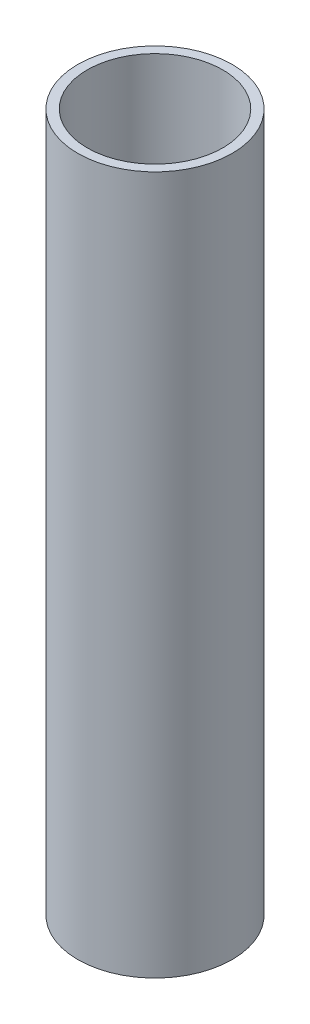
ISO-10303-21;
HEADER;
FILE_DESCRIPTION(('STEP AP214'),'2;1');
FILE_NAME('part.step','',(''),(''),'','','');
FILE_SCHEMA(('AUTOMOTIVE_DESIGN { 1 0 10303 214 1 1 1 1 }'));
ENDSEC;
DATA;
#1=APPLICATION_CONTEXT('core data for automotive mechanical design processes');
#2=APPLICATION_PROTOCOL_DEFINITION('international standard','automotive_design',2000,#1);
#3=PRODUCT_CONTEXT('',#1,'mechanical');
#4=PRODUCT('Part','Part','',(#3));
#5=PRODUCT_RELATED_PRODUCT_CATEGORY('part','',(#4));
#6=PRODUCT_DEFINITION_FORMATION('','',#4);
#7=PRODUCT_DEFINITION_CONTEXT('part definition',#1,'design');
#8=PRODUCT_DEFINITION('design','',#6,#7);
#9=PRODUCT_DEFINITION_SHAPE('','',#8);
#10=(LENGTH_UNIT() NAMED_UNIT(*) SI_UNIT(.MILLI.,.METRE.));
#11=(NAMED_UNIT(*) PLANE_ANGLE_UNIT() SI_UNIT($,.RADIAN.));
#12=(NAMED_UNIT(*) SI_UNIT($,.STERADIAN.) SOLID_ANGLE_UNIT());
#13=UNCERTAINTY_MEASURE_WITH_UNIT(LENGTH_MEASURE(1.E-05),#10,'distance_accuracy_value','');
#14=(GEOMETRIC_REPRESENTATION_CONTEXT(3) GLOBAL_UNCERTAINTY_ASSIGNED_CONTEXT((#13)) GLOBAL_UNIT_ASSIGNED_CONTEXT((#10,
#11,#12)) REPRESENTATION_CONTEXT('',''));
#15=CARTESIAN_POINT('',(0.,0.,0.));
#16=DIRECTION('',(0.,0.,1.));
#17=DIRECTION('',(1.,0.,0.));
#18=AXIS2_PLACEMENT_3D('',#15,#16,#17);
#19=CARTESIAN_POINT('',(0.,100.,0.));
#20=DIRECTION('',(0.,1.,0.));
#21=DIRECTION('',(0.,0.,1.));
#22=AXIS2_PLACEMENT_3D('',#19,#20,#21);
#23=PLANE('',#22);
#24=CARTESIAN_POINT('',(0.,100.,0.));
#25=DIRECTION('',(0.,1.,0.));
#26=DIRECTION('',(0.,0.,1.));
#27=AXIS2_PLACEMENT_3D('',#24,#25,#26);
#28=CIRCLE('',#27,11.05);
#29=CARTESIAN_POINT('',(0.,100.,11.05));
#30=VERTEX_POINT('',#29);
#31=EDGE_CURVE('E10',#30,#30,#28,.T.);
#32=ORIENTED_EDGE('',*,*,#31,.T.);
#33=EDGE_LOOP('',(#32));
#34=FACE_BOUND('',#33,.T.);
#35=CARTESIAN_POINT('',(0.,100.,0.));
#36=DIRECTION('',(0.,1.,0.));
#37=DIRECTION('',(0.,0.,1.));
#38=AXIS2_PLACEMENT_3D('',#35,#36,#37);
#39=CIRCLE('',#38,9.7);
#40=CARTESIAN_POINT('',(0.,100.,9.7));
#41=VERTEX_POINT('',#40);
#42=EDGE_CURVE('E42',#41,#41,#39,.T.);
#43=ORIENTED_EDGE('',*,*,#42,.F.);
#44=EDGE_LOOP('',(#43));
#45=FACE_BOUND('',#44,.T.);
#46=ADVANCED_FACE('F31',(#34,#45),#23,.T.);
#47=CARTESIAN_POINT('',(0.,0.,0.));
#48=DIRECTION('',(0.,1.,0.));
#49=DIRECTION('',(0.,0.,1.));
#50=AXIS2_PLACEMENT_3D('',#47,#48,#49);
#51=PLANE('',#50);
#52=CARTESIAN_POINT('',(0.,0.,0.));
#53=DIRECTION('',(0.,1.,0.));
#54=DIRECTION('',(0.,0.,1.));
#55=AXIS2_PLACEMENT_3D('',#52,#53,#54);
#56=CIRCLE('',#55,11.05);
#57=CARTESIAN_POINT('',(0.,0.,11.05));
#58=VERTEX_POINT('',#57);
#59=EDGE_CURVE('E35',#58,#58,#56,.T.);
#60=ORIENTED_EDGE('',*,*,#59,.F.);
#61=EDGE_LOOP('',(#60));
#62=FACE_BOUND('',#61,.T.);
#63=CARTESIAN_POINT('',(0.,0.,0.));
#64=DIRECTION('',(0.,1.,0.));
#65=DIRECTION('',(0.,0.,1.));
#66=AXIS2_PLACEMENT_3D('',#63,#64,#65);
#67=CIRCLE('',#66,9.7);
#68=CARTESIAN_POINT('',(0.,0.,9.7));
#69=VERTEX_POINT('',#68);
#70=EDGE_CURVE('E44',#69,#69,#67,.T.);
#71=ORIENTED_EDGE('',*,*,#70,.T.);
#72=EDGE_LOOP('',(#71));
#73=FACE_BOUND('',#72,.T.);
#74=ADVANCED_FACE('F54',(#62,#73),#51,.F.);
#75=CARTESIAN_POINT('',(0.,100.,0.));
#76=DIRECTION('',(0.,-1.,0.));
#77=DIRECTION('',(0.,0.,-1.));
#78=AXIS2_PLACEMENT_3D('',#75,#76,#77);
#79=CYLINDRICAL_SURFACE('',#78,11.05);
#80=ORIENTED_EDGE('',*,*,#31,.F.);
#81=EDGE_LOOP('',(#80));
#82=FACE_BOUND('',#81,.T.);
#83=ORIENTED_EDGE('',*,*,#59,.T.);
#84=EDGE_LOOP('',(#83));
#85=FACE_BOUND('',#84,.T.);
#86=ADVANCED_FACE('F33',(#82,#85),#79,.T.);
#87=CARTESIAN_POINT('',(0.,100.,0.));
#88=DIRECTION('',(0.,-1.,0.));
#89=DIRECTION('',(0.,0.,-1.));
#90=AXIS2_PLACEMENT_3D('',#87,#88,#89);
#91=CYLINDRICAL_SURFACE('',#90,9.7);
#92=ORIENTED_EDGE('',*,*,#42,.T.);
#93=EDGE_LOOP('',(#92));
#94=FACE_BOUND('',#93,.T.);
#95=ORIENTED_EDGE('',*,*,#70,.F.);
#96=EDGE_LOOP('',(#95));
#97=FACE_BOUND('',#96,.T.);
#98=ADVANCED_FACE('F50',(#94,#97),#91,.F.);
#99=CLOSED_SHELL('',(#46,#74,#86,#98));
#100=MANIFOLD_SOLID_BREP('B2',#99);
#101=ADVANCED_BREP_SHAPE_REPRESENTATION('',(#18,#100),#14);
#102=SHAPE_DEFINITION_REPRESENTATION(#9,#101);
ENDSEC;
END-ISO-10303-21;
